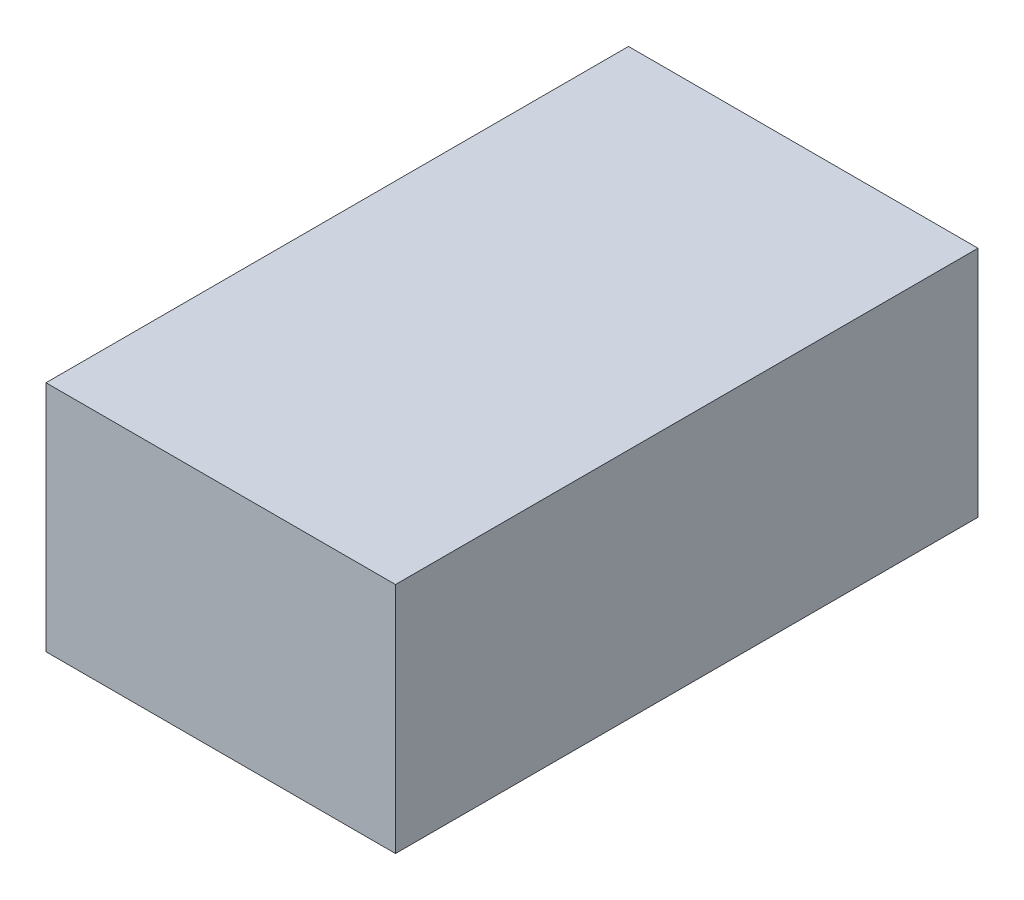
ISO-10303-21;
HEADER;
FILE_DESCRIPTION(('STEP AP214'),'2;1');
FILE_NAME('part.step','',(''),(''),'','','');
FILE_SCHEMA(('AUTOMOTIVE_DESIGN { 1 0 10303 214 1 1 1 1 }'));
ENDSEC;
DATA;
#1=APPLICATION_CONTEXT('core data for automotive mechanical design processes');
#2=APPLICATION_PROTOCOL_DEFINITION('international standard','automotive_design',2000,#1);
#3=PRODUCT_CONTEXT('',#1,'mechanical');
#4=PRODUCT('Part','Part','',(#3));
#5=PRODUCT_RELATED_PRODUCT_CATEGORY('part','',(#4));
#6=PRODUCT_DEFINITION_FORMATION('','',#4);
#7=PRODUCT_DEFINITION_CONTEXT('part definition',#1,'design');
#8=PRODUCT_DEFINITION('design','',#6,#7);
#9=PRODUCT_DEFINITION_SHAPE('','',#8);
#10=(LENGTH_UNIT() NAMED_UNIT(*) SI_UNIT(.MILLI.,.METRE.));
#11=(NAMED_UNIT(*) PLANE_ANGLE_UNIT() SI_UNIT($,.RADIAN.));
#12=(NAMED_UNIT(*) SI_UNIT($,.STERADIAN.) SOLID_ANGLE_UNIT());
#13=UNCERTAINTY_MEASURE_WITH_UNIT(LENGTH_MEASURE(1.E-05),#10,'distance_accuracy_value','');
#14=(GEOMETRIC_REPRESENTATION_CONTEXT(3) GLOBAL_UNCERTAINTY_ASSIGNED_CONTEXT((#13)) GLOBAL_UNIT_ASSIGNED_CONTEXT((#10,
#11,#12)) REPRESENTATION_CONTEXT('',''));
#15=CARTESIAN_POINT('',(0.,0.,0.));
#16=DIRECTION('',(0.,0.,1.));
#17=DIRECTION('',(1.,0.,0.));
#18=AXIS2_PLACEMENT_3D('',#15,#16,#17);
#19=CARTESIAN_POINT('',(30.,20.,100.));
#20=DIRECTION('',(-1.,0.,0.));
#21=DIRECTION('',(0.,-1.,0.));
#22=AXIS2_PLACEMENT_3D('',#19,#20,#21);
#23=PLANE('',#22);
#24=DIRECTION('',(0.,1.,0.));
#25=VECTOR('',#24,1.);
#26=CARTESIAN_POINT('',(30.,20.,0.));
#27=LINE('',#26,#25);
#28=CARTESIAN_POINT('',(30.,-20.,0.));
#29=VERTEX_POINT('',#28);
#30=CARTESIAN_POINT('',(30.,20.,0.));
#31=VERTEX_POINT('',#30);
#32=EDGE_CURVE('E107',#29,#31,#27,.T.);
#33=ORIENTED_EDGE('',*,*,#32,.T.);
#34=DIRECTION('',(0.,0.,-1.));
#35=VECTOR('',#34,1.);
#36=CARTESIAN_POINT('',(30.,20.,100.));
#37=LINE('',#36,#35);
#38=CARTESIAN_POINT('',(30.,20.,100.));
#39=VERTEX_POINT('',#38);
#40=EDGE_CURVE('E11',#39,#31,#37,.T.);
#41=ORIENTED_EDGE('',*,*,#40,.F.);
#42=DIRECTION('',(0.,1.,0.));
#43=VECTOR('',#42,1.);
#44=CARTESIAN_POINT('',(30.,20.,100.));
#45=LINE('',#44,#43);
#46=CARTESIAN_POINT('',(30.,-20.,100.));
#47=VERTEX_POINT('',#46);
#48=EDGE_CURVE('E91',#47,#39,#45,.T.);
#49=ORIENTED_EDGE('',*,*,#48,.F.);
#50=DIRECTION('',(0.,0.,-1.));
#51=VECTOR('',#50,1.);
#52=CARTESIAN_POINT('',(30.,-20.,100.));
#53=LINE('',#52,#51);
#54=EDGE_CURVE('E103',#47,#29,#53,.T.);
#55=ORIENTED_EDGE('',*,*,#54,.T.);
#56=EDGE_LOOP('',(#33,#41,#49,#55));
#57=FACE_BOUND('',#56,.T.);
#58=ADVANCED_FACE('F39',(#57),#23,.F.);
#59=CARTESIAN_POINT('',(-30.,20.,100.));
#60=DIRECTION('',(0.,-1.,0.));
#61=DIRECTION('',(0.,0.,-1.));
#62=AXIS2_PLACEMENT_3D('',#59,#60,#61);
#63=PLANE('',#62);
#64=DIRECTION('',(-1.,0.,0.));
#65=VECTOR('',#64,1.);
#66=CARTESIAN_POINT('',(-30.,20.,0.));
#67=LINE('',#66,#65);
#68=CARTESIAN_POINT('',(-30.,20.,0.));
#69=VERTEX_POINT('',#68);
#70=EDGE_CURVE('E96',#31,#69,#67,.T.);
#71=ORIENTED_EDGE('',*,*,#70,.T.);
#72=DIRECTION('',(0.,0.,-1.));
#73=VECTOR('',#72,1.);
#74=CARTESIAN_POINT('',(-30.,20.,100.));
#75=LINE('',#74,#73);
#76=CARTESIAN_POINT('',(-30.,20.,100.));
#77=VERTEX_POINT('',#76);
#78=EDGE_CURVE('E48',#77,#69,#75,.T.);
#79=ORIENTED_EDGE('',*,*,#78,.F.);
#80=DIRECTION('',(-1.,0.,0.));
#81=VECTOR('',#80,1.);
#82=CARTESIAN_POINT('',(-30.,20.,100.));
#83=LINE('',#82,#81);
#84=EDGE_CURVE('E86',#39,#77,#83,.T.);
#85=ORIENTED_EDGE('',*,*,#84,.F.);
#86=ORIENTED_EDGE('',*,*,#40,.T.);
#87=EDGE_LOOP('',(#71,#79,#85,#86));
#88=FACE_BOUND('',#87,.T.);
#89=ADVANCED_FACE('F95',(#88),#63,.F.);
#90=CARTESIAN_POINT('',(-30.,20.,100.));
#91=DIRECTION('',(1.,0.,0.));
#92=DIRECTION('',(0.,1.,0.));
#93=AXIS2_PLACEMENT_3D('',#90,#91,#92);
#94=PLANE('',#93);
#95=DIRECTION('',(0.,-1.,0.));
#96=VECTOR('',#95,1.);
#97=CARTESIAN_POINT('',(-30.,20.,0.));
#98=LINE('',#97,#96);
#99=CARTESIAN_POINT('',(-30.,-20.,0.));
#100=VERTEX_POINT('',#99);
#101=EDGE_CURVE('E73',#69,#100,#98,.T.);
#102=ORIENTED_EDGE('',*,*,#101,.T.);
#103=DIRECTION('',(0.,0.,-1.));
#104=VECTOR('',#103,1.);
#105=CARTESIAN_POINT('',(-30.,-20.,100.));
#106=LINE('',#105,#104);
#107=CARTESIAN_POINT('',(-30.,-20.,100.));
#108=VERTEX_POINT('',#107);
#109=EDGE_CURVE('E98',#108,#100,#106,.T.);
#110=ORIENTED_EDGE('',*,*,#109,.F.);
#111=DIRECTION('',(0.,-1.,0.));
#112=VECTOR('',#111,1.);
#113=CARTESIAN_POINT('',(-30.,20.,100.));
#114=LINE('',#113,#112);
#115=EDGE_CURVE('E89',#77,#108,#114,.T.);
#116=ORIENTED_EDGE('',*,*,#115,.F.);
#117=ORIENTED_EDGE('',*,*,#78,.T.);
#118=EDGE_LOOP('',(#102,#110,#116,#117));
#119=FACE_BOUND('',#118,.T.);
#120=ADVANCED_FACE('F99',(#119),#94,.F.);
#121=CARTESIAN_POINT('',(-30.,-20.,100.));
#122=DIRECTION('',(0.,1.,0.));
#123=DIRECTION('',(0.,0.,1.));
#124=AXIS2_PLACEMENT_3D('',#121,#122,#123);
#125=PLANE('',#124);
#126=DIRECTION('',(1.,0.,0.));
#127=VECTOR('',#126,1.);
#128=CARTESIAN_POINT('',(-30.,-20.,0.));
#129=LINE('',#128,#127);
#130=EDGE_CURVE('E79',#100,#29,#129,.T.);
#131=ORIENTED_EDGE('',*,*,#130,.T.);
#132=ORIENTED_EDGE('',*,*,#54,.F.);
#133=DIRECTION('',(1.,0.,0.));
#134=VECTOR('',#133,1.);
#135=CARTESIAN_POINT('',(-30.,-20.,100.));
#136=LINE('',#135,#134);
#137=EDGE_CURVE('E56',#108,#47,#136,.T.);
#138=ORIENTED_EDGE('',*,*,#137,.F.);
#139=ORIENTED_EDGE('',*,*,#109,.T.);
#140=EDGE_LOOP('',(#131,#132,#138,#139));
#141=FACE_BOUND('',#140,.T.);
#142=ADVANCED_FACE('F121',(#141),#125,.F.);
#143=CARTESIAN_POINT('',(0.,0.,100.));
#144=DIRECTION('',(0.,0.,1.));
#145=DIRECTION('',(1.,0.,0.));
#146=AXIS2_PLACEMENT_3D('',#143,#144,#145);
#147=PLANE('',#146);
#148=ORIENTED_EDGE('',*,*,#48,.T.);
#149=ORIENTED_EDGE('',*,*,#84,.T.);
#150=ORIENTED_EDGE('',*,*,#115,.T.);
#151=ORIENTED_EDGE('',*,*,#137,.T.);
#152=EDGE_LOOP('',(#148,#149,#150,#151));
#153=FACE_BOUND('',#152,.T.);
#154=ADVANCED_FACE('F87',(#153),#147,.T.);
#155=CARTESIAN_POINT('',(0.,0.,0.));
#156=DIRECTION('',(0.,0.,1.));
#157=DIRECTION('',(1.,0.,0.));
#158=AXIS2_PLACEMENT_3D('',#155,#156,#157);
#159=PLANE('',#158);
#160=CARTESIAN_POINT('',(0.,0.,0.));
#161=DIRECTION('',(0.,0.,-1.));
#162=DIRECTION('',(-1.,0.,0.));
#163=AXIS2_PLACEMENT_3D('',#160,#161,#162);
#164=CIRCLE('',#163,4.);
#165=CARTESIAN_POINT('',(-4.,0.,0.));
#166=VERTEX_POINT('',#165);
#167=EDGE_CURVE('E128',#166,#166,#164,.T.);
#168=ORIENTED_EDGE('',*,*,#167,.F.);
#169=EDGE_LOOP('',(#168));
#170=FACE_BOUND('',#169,.T.);
#171=ORIENTED_EDGE('',*,*,#32,.F.);
#172=ORIENTED_EDGE('',*,*,#130,.F.);
#173=ORIENTED_EDGE('',*,*,#101,.F.);
#174=ORIENTED_EDGE('',*,*,#70,.F.);
#175=EDGE_LOOP('',(#171,#172,#173,#174));
#176=FACE_BOUND('',#175,.T.);
#177=ADVANCED_FACE('F124',(#170,#176),#159,.F.);
#178=CARTESIAN_POINT('',(0.,0.,10.));
#179=DIRECTION('',(0.,0.,-1.));
#180=DIRECTION('',(-1.,0.,0.));
#181=AXIS2_PLACEMENT_3D('',#178,#179,#180);
#182=CYLINDRICAL_SURFACE('',#181,4.);
#183=CARTESIAN_POINT('',(0.,0.,10.));
#184=DIRECTION('',(0.,0.,-1.));
#185=DIRECTION('',(-1.,0.,0.));
#186=AXIS2_PLACEMENT_3D('',#183,#184,#185);
#187=CIRCLE('',#186,4.);
#188=CARTESIAN_POINT('',(-4.,0.,10.));
#189=VERTEX_POINT('',#188);
#190=EDGE_CURVE('E111',#189,#189,#187,.T.);
#191=ORIENTED_EDGE('',*,*,#190,.F.);
#192=EDGE_LOOP('',(#191));
#193=FACE_BOUND('',#192,.T.);
#194=ORIENTED_EDGE('',*,*,#167,.T.);
#195=EDGE_LOOP('',(#194));
#196=FACE_BOUND('',#195,.T.);
#197=ADVANCED_FACE('F138',(#193,#196),#182,.F.);
#198=CARTESIAN_POINT('',(0.,0.,10.));
#199=DIRECTION('',(0.,0.,-1.));
#200=DIRECTION('',(-1.,0.,0.));
#201=AXIS2_PLACEMENT_3D('',#198,#199,#200);
#202=PLANE('',#201);
#203=ORIENTED_EDGE('',*,*,#190,.T.);
#204=EDGE_LOOP('',(#203));
#205=FACE_BOUND('',#204,.T.);
#206=ADVANCED_FACE('F136',(#205),#202,.T.);
#207=CLOSED_SHELL('',(#58,#89,#120,#142,#154,#177,#197,#206));
#208=MANIFOLD_SOLID_BREP('B2',#207);
#209=ADVANCED_BREP_SHAPE_REPRESENTATION('',(#18,#208),#14);
#210=SHAPE_DEFINITION_REPRESENTATION(#9,#209);
ENDSEC;
END-ISO-10303-21;
